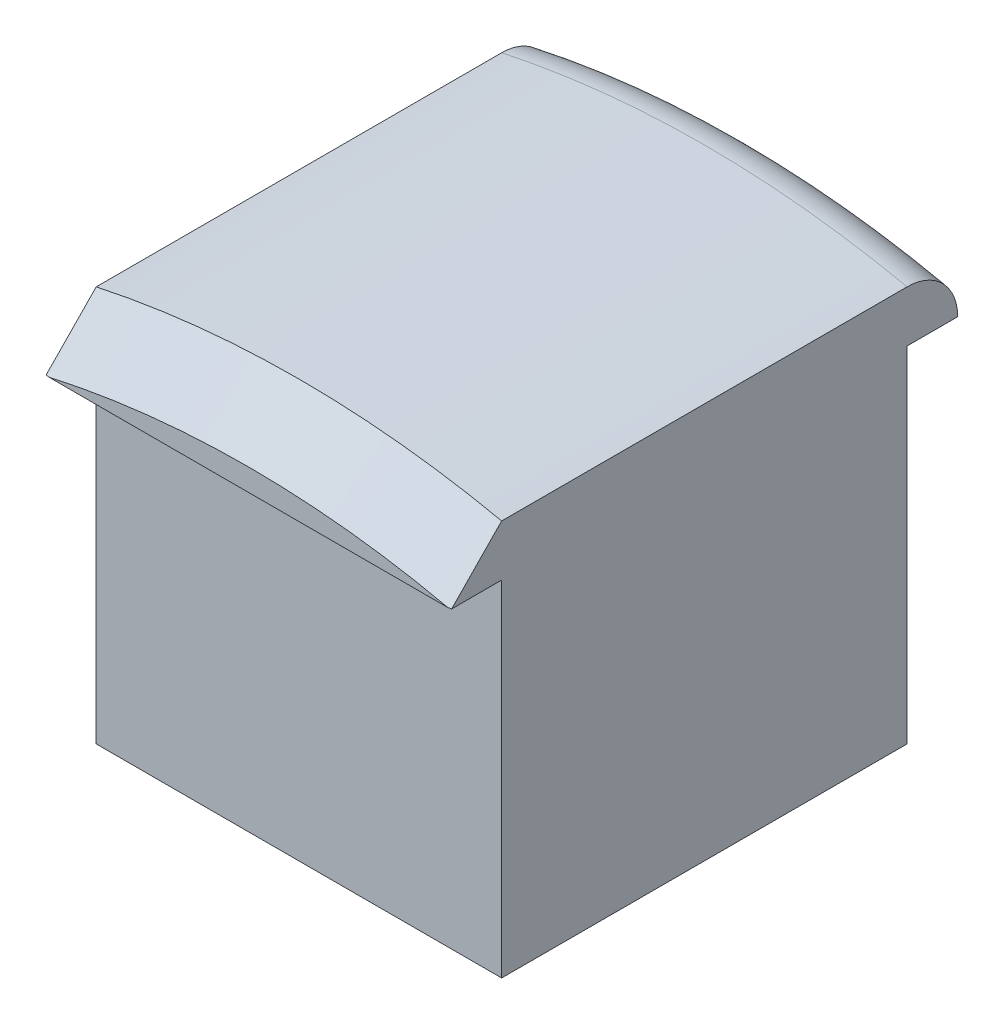
ISO-10303-21;
HEADER;
FILE_DESCRIPTION(('STEP AP214'),'2;1');
FILE_NAME('part.step','',(''),(''),'','','');
FILE_SCHEMA(('AUTOMOTIVE_DESIGN { 1 0 10303 214 1 1 1 1 }'));
ENDSEC;
DATA;
#1=APPLICATION_CONTEXT('core data for automotive mechanical design processes');
#2=APPLICATION_PROTOCOL_DEFINITION('international standard','automotive_design',2000,#1);
#3=PRODUCT_CONTEXT('',#1,'mechanical');
#4=PRODUCT('Part','Part','',(#3));
#5=PRODUCT_RELATED_PRODUCT_CATEGORY('part','',(#4));
#6=PRODUCT_DEFINITION_FORMATION('','',#4);
#7=PRODUCT_DEFINITION_CONTEXT('part definition',#1,'design');
#8=PRODUCT_DEFINITION('design','',#6,#7);
#9=PRODUCT_DEFINITION_SHAPE('','',#8);
#10=(LENGTH_UNIT() NAMED_UNIT(*) SI_UNIT(.MILLI.,.METRE.));
#11=(NAMED_UNIT(*) PLANE_ANGLE_UNIT() SI_UNIT($,.RADIAN.));
#12=(NAMED_UNIT(*) SI_UNIT($,.STERADIAN.) SOLID_ANGLE_UNIT());
#13=UNCERTAINTY_MEASURE_WITH_UNIT(LENGTH_MEASURE(1.E-05),#10,'distance_accuracy_value','');
#14=(GEOMETRIC_REPRESENTATION_CONTEXT(3) GLOBAL_UNCERTAINTY_ASSIGNED_CONTEXT((#13)) GLOBAL_UNIT_ASSIGNED_CONTEXT((#10,
#11,#12)) REPRESENTATION_CONTEXT('',''));
#15=CARTESIAN_POINT('',(0.,0.,0.));
#16=DIRECTION('',(0.,0.,1.));
#17=DIRECTION('',(1.,0.,0.));
#18=AXIS2_PLACEMENT_3D('',#15,#16,#17);
#19=CARTESIAN_POINT('',(-10.7945891997526,0.,50.));
#20=DIRECTION('',(-1.,0.,0.));
#21=DIRECTION('',(0.,-1.,0.));
#22=AXIS2_PLACEMENT_3D('',#19,#20,#21);
#23=PLANE('',#22);
#24=DIRECTION('',(0.,0.,-1.));
#25=VECTOR('',#24,1.);
#26=CARTESIAN_POINT('',(-10.7945891997528,115.897083669474,50.));
#27=LINE('',#26,#25);
#28=CARTESIAN_POINT('',(-10.7945891997528,115.897083669474,45.));
#29=VERTEX_POINT('',#28);
#30=CARTESIAN_POINT('',(-10.7945891997528,115.897083669474,5.));
#31=VERTEX_POINT('',#30);
#32=EDGE_CURVE('E262',#29,#31,#27,.T.);
#33=ORIENTED_EDGE('',*,*,#32,.F.);
#34=CARTESIAN_POINT('',(-10.7945891997528,115.897083669474,45.));
#35=CARTESIAN_POINT('',(-10.7945891997528,115.055807529842,45.8224501634708));
#36=CARTESIAN_POINT('',(-10.7945891997528,114.214262952471,46.6446253855792));
#37=CARTESIAN_POINT('',(-10.7945891997528,112.530636917463,48.2884259517434));
#38=CARTESIAN_POINT('',(-10.7945891997528,111.688555459823,49.1100512957961));
#39=CARTESIAN_POINT('',(-10.7945891997528,110.846205564441,49.9314016984831));
#40=B_SPLINE_CURVE_WITH_KNOTS('',3,(#34,#35,#36,#37,#38,#39),.UNSPECIFIED.,.F.,.F.,(4,2,4),(0.,
3.52952182936607,7.05904367879718),.UNSPECIFIED.);
#41=CARTESIAN_POINT('',(-10.7945891997528,110.846205564441,49.9314016984831));
#42=VERTEX_POINT('',#41);
#43=EDGE_CURVE('E11',#29,#42,#40,.T.);
#44=ORIENTED_EDGE('',*,*,#43,.T.);
#45=DIRECTION('',(0.,0.,-1.));
#46=VECTOR('',#45,1.);
#47=CARTESIAN_POINT('',(-10.7945891997528,110.846205564441,50.));
#48=LINE('',#47,#46);
#49=CARTESIAN_POINT('',(-10.7945891997528,110.846205564441,45.));
#50=VERTEX_POINT('',#49);
#51=EDGE_CURVE('E240',#42,#50,#48,.T.);
#52=ORIENTED_EDGE('',*,*,#51,.T.);
#53=DIRECTION('',(0.,-1.,0.));
#54=VECTOR('',#53,1.);
#55=CARTESIAN_POINT('',(-10.7945891997526,0.,45.));
#56=LINE('',#55,#54);
#57=CARTESIAN_POINT('',(-10.7945891997528,76.8462055644408,45.));
#58=VERTEX_POINT('',#57);
#59=EDGE_CURVE('E243',#50,#58,#56,.T.);
#60=ORIENTED_EDGE('',*,*,#59,.T.);
#61=DIRECTION('',(0.,0.,-1.));
#62=VECTOR('',#61,1.);
#63=CARTESIAN_POINT('',(-10.7945891997528,76.8462055644408,50.));
#64=LINE('',#63,#62);
#65=CARTESIAN_POINT('',(-10.7945891997528,76.8462055644408,5.));
#66=VERTEX_POINT('',#65);
#67=EDGE_CURVE('E251',#58,#66,#64,.T.);
#68=ORIENTED_EDGE('',*,*,#67,.T.);
#69=DIRECTION('',(0.,1.,0.));
#70=VECTOR('',#69,1.);
#71=CARTESIAN_POINT('',(-10.7945891997526,0.,4.99999999999999));
#72=LINE('',#71,#70);
#73=CARTESIAN_POINT('',(-10.7945891997528,110.846205564441,5.));
#74=VERTEX_POINT('',#73);
#75=EDGE_CURVE('E247',#66,#74,#72,.T.);
#76=ORIENTED_EDGE('',*,*,#75,.T.);
#77=DIRECTION('',(0.,0.,-1.));
#78=VECTOR('',#77,1.);
#79=CARTESIAN_POINT('',(-10.7945891997528,110.846205564441,50.));
#80=LINE('',#79,#78);
#81=CARTESIAN_POINT('',(-10.7945891997528,110.846205564441,0.000470594843045291));
#82=VERTEX_POINT('',#81);
#83=EDGE_CURVE('E221',#74,#82,#80,.T.);
#84=ORIENTED_EDGE('',*,*,#83,.T.);
#85=CARTESIAN_POINT('',(-10.7945891997528,110.846205564441,0.000470594843047893));
#86=CARTESIAN_POINT('',(-10.7945891997528,110.992824735912,0.00241884125250696));
#87=CARTESIAN_POINT('',(-10.7945891997528,111.139361629295,0.0105251535922472));
#88=CARTESIAN_POINT('',(-10.7945891997528,111.43124765879,0.0389568587041299));
#89=CARTESIAN_POINT('',(-10.7945891997528,111.576596774703,0.0592824588376026));
#90=CARTESIAN_POINT('',(-10.7945891997528,111.865085477981,0.112056800033257));
#91=CARTESIAN_POINT('',(-10.7945891997528,112.008224965854,0.144506085334537));
#92=CARTESIAN_POINT('',(-10.7945891997528,112.291263078148,0.221333749418454));
#93=CARTESIAN_POINT('',(-10.7945891997528,112.431161787298,0.265711815944276));
#94=CARTESIAN_POINT('',(-10.7945891997528,112.706799437564,0.366164479831274));
#95=CARTESIAN_POINT('',(-10.7945891997528,112.842535627021,0.422246630902114));
#96=CARTESIAN_POINT('',(-10.7945891997528,113.108802769342,0.545765306722478));
#97=CARTESIAN_POINT('',(-10.7945891997528,113.239331778248,0.613206023715194));
#98=CARTESIAN_POINT('',(-10.7945891997528,113.49405290906,0.758941401320211));
#99=CARTESIAN_POINT('',(-10.7945891997528,113.61824978702,0.837227746468482));
#100=CARTESIAN_POINT('',(-10.7945891997528,113.859503331531,1.00420915287417));
#101=CARTESIAN_POINT('',(-10.7945891997528,113.976557555855,1.09290774432923));
#102=CARTESIAN_POINT('',(-10.7945891997528,114.201049862749,1.27884051093465));
#103=CARTESIAN_POINT('',(-10.7945891997528,114.308595572458,1.37594473746499));
#104=CARTESIAN_POINT('',(-10.7945891997528,114.514957399316,1.57902284981378));
#105=CARTESIAN_POINT('',(-10.7945891997528,114.613773727637,1.6849965209517));
#106=CARTESIAN_POINT('',(-10.7945891997528,114.801929149279,1.90512374306444));
#107=CARTESIAN_POINT('',(-10.7945891997528,114.891264406327,2.01928057408188));
#108=CARTESIAN_POINT('',(-10.7945891997528,115.059652213162,2.25487846517248));
#109=CARTESIAN_POINT('',(-10.7945891997528,115.138708717498,2.37631669743847));
#110=CARTESIAN_POINT('',(-10.7945891997528,115.284267472185,2.62282765723561));
#111=CARTESIAN_POINT('',(-10.7945891997528,115.351011842945,2.74775746193799));
#112=CARTESIAN_POINT('',(-10.7945891997528,115.473522828507,3.00282887240683));
#113=CARTESIAN_POINT('',(-10.7945891997528,115.52929385437,3.13296835856587));
#114=CARTESIAN_POINT('',(-10.7945891997528,115.629401213092,3.39747973294122));
#115=CARTESIAN_POINT('',(-10.7945891997528,115.673744865963,3.531848849571));
#116=CARTESIAN_POINT('',(-10.7945891997528,115.75066560474,3.80386316949725));
#117=CARTESIAN_POINT('',(-10.7945891997528,115.783246607586,3.941507265927));
#118=CARTESIAN_POINT('',(-10.7945891997528,115.838826536844,4.23187345591465));
#119=CARTESIAN_POINT('',(-10.7945891997528,115.860668975691,4.38481825071767));
#120=CARTESIAN_POINT('',(-10.7945891997528,115.889799903708,4.69184409044814));
#121=CARTESIAN_POINT('',(-10.7945891997528,115.897111198458,4.84592297338458));
#122=CARTESIAN_POINT('',(-10.7945891997528,115.897083669474,5.));
#123=B_SPLINE_CURVE_WITH_KNOTS('',3,(#85,#86,#87,#88,#89,#90,#91,#92,#93,#94,#95,#96,#97,#98,
#99,#100,#101,#102,#103,#104,#105,#106,#107,#108,#109,#110,#111,#112,#113,#114,#115,#116,#117,
#118,#119,#120,#121,#122),.UNSPECIFIED.,.F.,.F.,(4,2,2,2,2,2,2,2,2,2,2,2,2,2,2,2,2,2,4),(0.,
0.439768076604842,0.8795436162852,1.31933890011123,1.75912267264367,2.19919116026993,
2.63942242665716,3.07931801181938,3.51936317354784,3.95352604575093,4.38767841229298,
4.82200578311586,5.25616555743005,5.6805725578725,6.10480860522797,6.52877222114458,
6.95259452745411,7.41538592575938,7.87745043104914),.UNSPECIFIED.);
#124=EDGE_CURVE('E360',#82,#31,#123,.T.);
#125=ORIENTED_EDGE('',*,*,#124,.T.);
#126=EDGE_LOOP('',(#33,#44,#52,#60,#68,#76,#84,#125));
#127=FACE_BOUND('',#126,.T.);
#128=ADVANCED_FACE('F48',(#127),#23,.F.);
#129=CARTESIAN_POINT('',(-30.7945891997528,23.0262055644407,50.));
#130=DIRECTION('',(0.,0.,-1.));
#131=DIRECTION('',(-1.,0.,0.));
#132=AXIS2_PLACEMENT_3D('',#129,#130,#131);
#133=CYLINDRICAL_SURFACE('',#132,95.);
#134=DIRECTION('',(0.,0.,-1.));
#135=VECTOR('',#134,1.);
#136=CARTESIAN_POINT('',(-50.7945891997528,115.897083669474,50.));
#137=LINE('',#136,#135);
#138=CARTESIAN_POINT('',(-50.7945891997528,115.897083669474,45.));
#139=VERTEX_POINT('',#138);
#140=CARTESIAN_POINT('',(-50.7945891997528,115.897083669474,5.));
#141=VERTEX_POINT('',#140);
#142=EDGE_CURVE('E259',#139,#141,#137,.T.);
#143=ORIENTED_EDGE('',*,*,#142,.F.);
#144=CARTESIAN_POINT('',(-30.7945891997528,23.0262055644407,45.));
#145=DIRECTION('',(0.,0.,1.));
#146=DIRECTION('',(1.,0.,0.));
#147=AXIS2_PLACEMENT_3D('',#144,#145,#146);
#148=CIRCLE('',#147,95.);
#149=EDGE_CURVE('E64',#139,#29,#148,.F.);
#150=ORIENTED_EDGE('',*,*,#149,.T.);
#151=ORIENTED_EDGE('',*,*,#32,.T.);
#152=CARTESIAN_POINT('',(-30.7945891997528,23.0262055644407,5.));
#153=DIRECTION('',(0.,0.,1.));
#154=DIRECTION('',(1.,0.,0.));
#155=AXIS2_PLACEMENT_3D('',#152,#153,#154);
#156=CIRCLE('',#155,95.);
#157=EDGE_CURVE('E273',#31,#141,#156,.T.);
#158=ORIENTED_EDGE('',*,*,#157,.T.);
#159=EDGE_LOOP('',(#143,#150,#151,#158));
#160=FACE_BOUND('',#159,.T.);
#161=ADVANCED_FACE('F377',(#160),#133,.T.);
#162=CARTESIAN_POINT('',(-50.7945891997528,0.,50.));
#163=DIRECTION('',(-1.,0.,0.));
#164=DIRECTION('',(0.,0.,1.));
#165=AXIS2_PLACEMENT_3D('',#162,#163,#164);
#166=PLANE('',#165);
#167=DIRECTION('',(0.,0.,-1.));
#168=VECTOR('',#167,1.);
#169=CARTESIAN_POINT('',(-50.7945891997528,110.846205564441,50.));
#170=LINE('',#169,#168);
#171=CARTESIAN_POINT('',(-50.7945891997528,110.846205564441,49.9314016984831));
#172=VERTEX_POINT('',#171);
#173=CARTESIAN_POINT('',(-50.7945891997528,110.846205564441,45.));
#174=VERTEX_POINT('',#173);
#175=EDGE_CURVE('E212',#172,#174,#170,.T.);
#176=ORIENTED_EDGE('',*,*,#175,.F.);
#177=CARTESIAN_POINT('',(-50.7945891997528,110.846205564441,49.9314016984831));
#178=CARTESIAN_POINT('',(-50.7945891997528,111.688555459823,49.1100512957961));
#179=CARTESIAN_POINT('',(-50.7945891997528,112.530636917463,48.2884259517434));
#180=CARTESIAN_POINT('',(-50.7945891997528,114.214262952471,46.6446253855792));
#181=CARTESIAN_POINT('',(-50.7945891997528,115.055807529842,45.8224501634708));
#182=CARTESIAN_POINT('',(-50.7945891997528,115.897083669474,45.));
#183=B_SPLINE_CURVE_WITH_KNOTS('',3,(#177,#178,#179,#180,#181,#182),.UNSPECIFIED.,.F.,.F.,(4,2,
4),(0.,3.5295218494311,7.05904367879717),.UNSPECIFIED.);
#184=EDGE_CURVE('E78',#172,#139,#183,.T.);
#185=ORIENTED_EDGE('',*,*,#184,.T.);
#186=ORIENTED_EDGE('',*,*,#142,.T.);
#187=CARTESIAN_POINT('',(-50.7945891997528,115.897083669474,5.));
#188=CARTESIAN_POINT('',(-50.7945891997528,115.897100640286,4.86169175819975));
#189=CARTESIAN_POINT('',(-50.7945891997528,115.891214086124,4.72338678120523));
#190=CARTESIAN_POINT('',(-50.7945891997528,115.867757157794,4.44778331834072));
#191=CARTESIAN_POINT('',(-50.7945891997528,115.850187844222,4.3104847422503));
#192=CARTESIAN_POINT('',(-50.7945891997528,115.803520177982,4.03805300206223));
#193=CARTESIAN_POINT('',(-50.7945891997528,115.77443745641,3.90291715947973));
#194=CARTESIAN_POINT('',(-50.7945891997528,115.704981088395,3.63558051347533));
#195=CARTESIAN_POINT('',(-50.7945891997528,115.664607487894,3.50337969811361));
#196=CARTESIAN_POINT('',(-50.7945891997528,115.572884793542,3.24283155121543));
#197=CARTESIAN_POINT('',(-50.7945891997528,115.521534843344,3.11448452123324));
#198=CARTESIAN_POINT('',(-50.7945891997528,115.408243617904,2.86249773611401));
#199=CARTESIAN_POINT('',(-50.7945891997528,115.346298438276,2.73885973688377));
#200=CARTESIAN_POINT('',(-50.7945891997528,115.212335945025,2.49723280267466));
#201=CARTESIAN_POINT('',(-50.7945891997528,115.140322669197,2.37924162838372));
#202=CARTESIAN_POINT('',(-50.7945891997528,114.986724657745,2.14960166702444));
#203=CARTESIAN_POINT('',(-50.7945891997528,114.905136366505,2.03795525902999));
#204=CARTESIAN_POINT('',(-50.7945891997528,114.732243345511,1.82080851950503));
#205=CARTESIAN_POINT('',(-50.7945891997528,114.640857710596,1.71537261116618));
#206=CARTESIAN_POINT('',(-50.7945891997528,114.449630730645,1.51239934321918));
#207=CARTESIAN_POINT('',(-50.7945891997528,114.349786272147,1.41486491799916));
#208=CARTESIAN_POINT('',(-50.7945891997528,114.142414895506,1.2283699085397));
#209=CARTESIAN_POINT('',(-50.7945891997528,114.0348890485,1.13940813293038));
#210=CARTESIAN_POINT('',(-50.7945891997528,113.812873014538,0.970563030582925));
#211=CARTESIAN_POINT('',(-50.7945891997528,113.69838032228,0.890682999649061));
#212=CARTESIAN_POINT('',(-50.7945891997528,113.460780745968,0.738931222829886));
#213=CARTESIAN_POINT('',(-50.7945891997528,113.337542951837,0.667264388396756));
#214=CARTESIAN_POINT('',(-50.7945891997528,113.085510341675,0.534347879199488));
#215=CARTESIAN_POINT('',(-50.7945891997528,112.956713212413,0.473102594243634));
#216=CARTESIAN_POINT('',(-50.7945891997528,112.694590584561,0.361464075216653));
#217=CARTESIAN_POINT('',(-50.7945891997528,112.561268005211,0.31106399364203));
#218=CARTESIAN_POINT('',(-50.7945891997528,112.290942011185,0.221353411181061));
#219=CARTESIAN_POINT('',(-50.7945891997528,112.153937995853,0.182044732128938));
#220=CARTESIAN_POINT('',(-50.7945891997528,111.824099773053,0.101852815239192));
#221=CARTESIAN_POINT('',(-50.7945891997528,111.629973610421,0.0661292009447279));
#222=CARTESIAN_POINT('',(-50.7945891997528,111.336964646439,0.0291006465087537));
#223=CARTESIAN_POINT('',(-50.7945891997528,111.239048242079,0.0195180297900822));
#224=CARTESIAN_POINT('',(-50.7945891997528,111.042843829177,0.00586197013069639));
#225=CARTESIAN_POINT('',(-50.7945891997528,110.944555867102,0.00178785975575689));
#226=CARTESIAN_POINT('',(-50.7945891997528,110.846205564441,0.000470594843047458));
#227=B_SPLINE_CURVE_WITH_KNOTS('',3,(#187,#188,#189,#190,#191,#192,#193,#194,#195,#196,#197,
#198,#199,#200,#201,#202,#203,#204,#205,#206,#207,#208,#209,#210,#211,#212,#213,#214,#215,#216,
#217,#218,#219,#220,#221,#222,#223,#224,#225,#226),.UNSPECIFIED.,.F.,.F.,(4,2,2,2,2,2,2,2,2,2,2,
2,2,2,2,2,2,2,2,4),(0.,0.414794702128333,0.829551753021808,1.24374763243906,1.65794182657772,
2.07216834691746,2.48654784162196,2.90076162421433,3.31512971191674,3.73323042184623,
4.15148569752227,4.56968276277667,4.98803111235585,5.41522033116821,5.84258904933379,
6.26968713618032,6.69685533585059,7.28757698418091,7.58260043714232,7.87758814059408),.UNSPECIFIED.);
#228=CARTESIAN_POINT('',(-50.7945891997528,110.846205564441,0.000470594843047893));
#229=VERTEX_POINT('',#228);
#230=EDGE_CURVE('E277',#141,#229,#227,.T.);
#231=ORIENTED_EDGE('',*,*,#230,.T.);
#232=DIRECTION('',(0.,0.,-1.));
#233=VECTOR('',#232,1.);
#234=CARTESIAN_POINT('',(-50.7945891997528,110.846205564441,0.));
#235=LINE('',#234,#233);
#236=CARTESIAN_POINT('',(-50.7945891997528,110.846205564441,5.));
#237=VERTEX_POINT('',#236);
#238=EDGE_CURVE('E211',#237,#229,#235,.T.);
#239=ORIENTED_EDGE('',*,*,#238,.F.);
#240=DIRECTION('',(0.,1.,0.));
#241=VECTOR('',#240,1.);
#242=CARTESIAN_POINT('',(-50.7945891997528,110.846205564441,5.));
#243=LINE('',#242,#241);
#244=CARTESIAN_POINT('',(-50.7945891997528,76.8462055644408,5.));
#245=VERTEX_POINT('',#244);
#246=EDGE_CURVE('E207',#245,#237,#243,.T.);
#247=ORIENTED_EDGE('',*,*,#246,.F.);
#248=DIRECTION('',(0.,0.,-1.));
#249=VECTOR('',#248,1.);
#250=CARTESIAN_POINT('',(-50.7945891997528,76.8462055644408,50.));
#251=LINE('',#250,#249);
#252=CARTESIAN_POINT('',(-50.7945891997528,76.8462055644408,45.));
#253=VERTEX_POINT('',#252);
#254=EDGE_CURVE('E255',#253,#245,#251,.T.);
#255=ORIENTED_EDGE('',*,*,#254,.F.);
#256=DIRECTION('',(0.,-1.,0.));
#257=VECTOR('',#256,1.);
#258=CARTESIAN_POINT('',(-50.7945891997528,110.846205564441,45.));
#259=LINE('',#258,#257);
#260=EDGE_CURVE('E229',#174,#253,#259,.T.);
#261=ORIENTED_EDGE('',*,*,#260,.F.);
#262=EDGE_LOOP('',(#176,#185,#186,#231,#239,#247,#255,#261));
#263=FACE_BOUND('',#262,.T.);
#264=ADVANCED_FACE('F292',(#263),#166,.T.);
#265=CARTESIAN_POINT('',(0.,76.8462055644408,50.));
#266=DIRECTION('',(0.,1.,0.));
#267=DIRECTION('',(0.,0.,1.));
#268=AXIS2_PLACEMENT_3D('',#265,#266,#267);
#269=PLANE('',#268);
#270=ORIENTED_EDGE('',*,*,#254,.T.);
#271=DIRECTION('',(-1.,0.,0.));
#272=VECTOR('',#271,1.);
#273=CARTESIAN_POINT('',(-0.794589199752775,76.8462055644408,5.));
#274=LINE('',#273,#272);
#275=EDGE_CURVE('E216',#66,#245,#274,.T.);
#276=ORIENTED_EDGE('',*,*,#275,.F.);
#277=ORIENTED_EDGE('',*,*,#67,.F.);
#278=DIRECTION('',(-1.,0.,0.));
#279=VECTOR('',#278,1.);
#280=CARTESIAN_POINT('',(-0.794589199752775,76.8462055644408,45.));
#281=LINE('',#280,#279);
#282=EDGE_CURVE('E200',#58,#253,#281,.T.);
#283=ORIENTED_EDGE('',*,*,#282,.T.);
#284=EDGE_LOOP('',(#270,#276,#277,#283));
#285=FACE_BOUND('',#284,.T.);
#286=ADVANCED_FACE('F390',(#285),#269,.F.);
#287=CARTESIAN_POINT('',(0.,0.,50.));
#288=DIRECTION('',(0.,0.,1.));
#289=DIRECTION('',(1.,0.,0.));
#290=AXIS2_PLACEMENT_3D('',#287,#288,#289);
#291=PLANE('',#290);
#292=DIRECTION('',(-1.,0.,0.));
#293=VECTOR('',#292,1.);
#294=CARTESIAN_POINT('',(0.,110.846205564441,50.));
#295=LINE('',#294,#293);
#296=CARTESIAN_POINT('',(-11.1058208279121,110.846205564441,50.));
#297=VERTEX_POINT('',#296);
#298=CARTESIAN_POINT('',(-50.4833575715935,110.846205564441,50.));
#299=VERTEX_POINT('',#298);
#300=EDGE_CURVE('E269',#297,#299,#295,.T.);
#301=ORIENTED_EDGE('',*,*,#300,.F.);
#302=CARTESIAN_POINT('',(-30.7945891997528,23.0262055644407,50.));
#303=DIRECTION('',(0.,0.,1.));
#304=DIRECTION('',(1.,0.,0.));
#305=AXIS2_PLACEMENT_3D('',#302,#303,#304);
#306=CIRCLE('',#305,90.);
#307=EDGE_CURVE('E357',#297,#299,#306,.T.);
#308=ORIENTED_EDGE('',*,*,#307,.T.);
#309=EDGE_LOOP('',(#301,#308));
#310=FACE_BOUND('',#309,.T.);
#311=ADVANCED_FACE('F384',(#310),#291,.T.);
#312=CARTESIAN_POINT('',(0.,0.,0.));
#313=DIRECTION('',(0.,0.,1.));
#314=DIRECTION('',(1.,0.,0.));
#315=AXIS2_PLACEMENT_3D('',#312,#313,#314);
#316=PLANE('',#315);
#317=DIRECTION('',(-1.,0.,0.));
#318=VECTOR('',#317,1.);
#319=CARTESIAN_POINT('',(0.,110.846205564441,0.));
#320=LINE('',#319,#318);
#321=CARTESIAN_POINT('',(-11.105820827912,110.846205564441,0.));
#322=VERTEX_POINT('',#321);
#323=CARTESIAN_POINT('',(-50.4833575715936,110.846205564441,0.));
#324=VERTEX_POINT('',#323);
#325=EDGE_CURVE('E265',#322,#324,#320,.T.);
#326=ORIENTED_EDGE('',*,*,#325,.T.);
#327=CARTESIAN_POINT('',(-30.7945891997528,23.0262055644407,0.));
#328=DIRECTION('',(0.,0.,1.));
#329=DIRECTION('',(1.,0.,0.));
#330=AXIS2_PLACEMENT_3D('',#327,#328,#329);
#331=CIRCLE('',#330,90.);
#332=EDGE_CURVE('E312',#324,#322,#331,.F.);
#333=ORIENTED_EDGE('',*,*,#332,.T.);
#334=EDGE_LOOP('',(#326,#333));
#335=FACE_BOUND('',#334,.T.);
#336=ADVANCED_FACE('F325',(#335),#316,.F.);
#337=CARTESIAN_POINT('',(-0.794589199752775,110.846205564441,5.));
#338=DIRECTION('',(0.,0.,1.));
#339=DIRECTION('',(0.,-1.,0.));
#340=AXIS2_PLACEMENT_3D('',#337,#338,#339);
#341=PLANE('',#340);
#342=DIRECTION('',(-1.,0.,0.));
#343=VECTOR('',#342,1.);
#344=CARTESIAN_POINT('',(-12.7945891997528,78.8462055644408,5.));
#345=LINE('',#344,#343);
#346=CARTESIAN_POINT('',(-12.7945891997528,78.8462055644408,5.));
#347=VERTEX_POINT('',#346);
#348=CARTESIAN_POINT('',(-48.7945891997528,78.8462055644408,5.));
#349=VERTEX_POINT('',#348);
#350=EDGE_CURVE('E186',#347,#349,#345,.T.);
#351=ORIENTED_EDGE('',*,*,#350,.F.);
#352=DIRECTION('',(0.,-1.,0.));
#353=VECTOR('',#352,1.);
#354=CARTESIAN_POINT('',(-12.7945891997528,110.846205564441,5.));
#355=LINE('',#354,#353);
#356=CARTESIAN_POINT('',(-12.7945891997528,110.846205564441,5.));
#357=VERTEX_POINT('',#356);
#358=EDGE_CURVE('E163',#357,#347,#355,.T.);
#359=ORIENTED_EDGE('',*,*,#358,.F.);
#360=DIRECTION('',(-1.,0.,0.));
#361=VECTOR('',#360,1.);
#362=CARTESIAN_POINT('',(-0.794589199752775,110.846205564441,5.));
#363=LINE('',#362,#361);
#364=EDGE_CURVE('E217',#74,#357,#363,.T.);
#365=ORIENTED_EDGE('',*,*,#364,.F.);
#366=ORIENTED_EDGE('',*,*,#75,.F.);
#367=ORIENTED_EDGE('',*,*,#275,.T.);
#368=ORIENTED_EDGE('',*,*,#246,.T.);
#369=CARTESIAN_POINT('',(-48.7945891997528,110.846205564441,5.));
#370=VERTEX_POINT('',#369);
#371=EDGE_CURVE('E222',#370,#237,#363,.T.);
#372=ORIENTED_EDGE('',*,*,#371,.F.);
#373=DIRECTION('',(0.,1.,0.));
#374=VECTOR('',#373,1.);
#375=CARTESIAN_POINT('',(-48.7945891997528,110.846205564441,5.));
#376=LINE('',#375,#374);
#377=EDGE_CURVE('E183',#349,#370,#376,.T.);
#378=ORIENTED_EDGE('',*,*,#377,.F.);
#379=EDGE_LOOP('',(#351,#359,#365,#366,#367,#368,#372,#378));
#380=FACE_BOUND('',#379,.T.);
#381=ADVANCED_FACE('F319',(#380),#341,.F.);
#382=CARTESIAN_POINT('',(-0.794589199752775,110.846205564441,0.));
#383=DIRECTION('',(0.,1.,0.));
#384=DIRECTION('',(0.,0.,1.));
#385=AXIS2_PLACEMENT_3D('',#382,#383,#384);
#386=PLANE('',#385);
#387=ORIENTED_EDGE('',*,*,#238,.T.);
#388=CARTESIAN_POINT('',(-50.7945891997528,110.846205564441,0.000470594843047893));
#389=CARTESIAN_POINT('',(-50.7427173809836,110.846205564441,0.000313143238279812));
#390=CARTESIAN_POINT('',(-50.6908455024744,110.846205564441,0.000195201198976157));
#391=CARTESIAN_POINT('',(-50.5871016264213,110.846205564441,3.83362519713775E-05));
#392=CARTESIAN_POINT('',(-50.5352296288775,110.846205564441,-5.86656408465413E-07));
#393=CARTESIAN_POINT('',(-50.4833575715936,110.846205564441,0.));
#394=B_SPLINE_CURVE_WITH_KNOTS('',3,(#388,#389,#390,#391,#392,#393),.UNSPECIFIED.,.F.,.F.,(4,2,
4),(0.,0.155616037777672,0.311232074218711),.UNSPECIFIED.);
#395=EDGE_CURVE('E305',#229,#324,#394,.T.);
#396=ORIENTED_EDGE('',*,*,#395,.T.);
#397=ORIENTED_EDGE('',*,*,#325,.F.);
#398=CARTESIAN_POINT('',(-11.105820827912,110.846205564441,0.));
#399=CARTESIAN_POINT('',(-11.0539487706281,110.846205564441,-5.8665640689847E-07));
#400=CARTESIAN_POINT('',(-11.0020767730843,110.846205564441,3.83362519722024E-05));
#401=CARTESIAN_POINT('',(-10.8983328970312,110.846205564441,0.000195201198976079));
#402=CARTESIAN_POINT('',(-10.846461018522,110.846205564441,0.000313143238279571));
#403=CARTESIAN_POINT('',(-10.7945891997528,110.846205564441,0.000470594843047777));
#404=B_SPLINE_CURVE_WITH_KNOTS('',3,(#398,#399,#400,#401,#402,#403),.UNSPECIFIED.,.F.,.F.,(4,2,
4),(0.,0.155616036441034,0.311232074218693),.UNSPECIFIED.);
#405=EDGE_CURVE('E285',#322,#82,#404,.T.);
#406=ORIENTED_EDGE('',*,*,#405,.T.);
#407=ORIENTED_EDGE('',*,*,#83,.F.);
#408=ORIENTED_EDGE('',*,*,#364,.T.);
#409=DIRECTION('',(0.,0.,-1.));
#410=VECTOR('',#409,1.);
#411=CARTESIAN_POINT('',(-12.7945891997528,110.846205564441,43.));
#412=LINE('',#411,#410);
#413=CARTESIAN_POINT('',(-12.7945891997528,110.846205564441,43.));
#414=VERTEX_POINT('',#413);
#415=EDGE_CURVE('E197',#414,#357,#412,.T.);
#416=ORIENTED_EDGE('',*,*,#415,.F.);
#417=DIRECTION('',(1.,0.,0.));
#418=VECTOR('',#417,1.);
#419=CARTESIAN_POINT('',(-12.7945891997528,110.846205564441,43.));
#420=LINE('',#419,#418);
#421=CARTESIAN_POINT('',(-48.7945891997528,110.846205564441,43.));
#422=VERTEX_POINT('',#421);
#423=EDGE_CURVE('E169',#422,#414,#420,.T.);
#424=ORIENTED_EDGE('',*,*,#423,.F.);
#425=DIRECTION('',(0.,0.,-1.));
#426=VECTOR('',#425,1.);
#427=CARTESIAN_POINT('',(-48.7945891997528,110.846205564441,43.));
#428=LINE('',#427,#426);
#429=EDGE_CURVE('E201',#422,#370,#428,.T.);
#430=ORIENTED_EDGE('',*,*,#429,.T.);
#431=ORIENTED_EDGE('',*,*,#371,.T.);
#432=EDGE_LOOP('',(#387,#396,#397,#406,#407,#408,#416,#424,#430,#431));
#433=FACE_BOUND('',#432,.T.);
#434=ADVANCED_FACE('F313',(#433),#386,.F.);
#435=CARTESIAN_POINT('',(-0.794589199752775,110.846205564441,45.));
#436=DIRECTION('',(0.,0.,-1.));
#437=DIRECTION('',(0.,1.,0.));
#438=AXIS2_PLACEMENT_3D('',#435,#436,#437);
#439=PLANE('',#438);
#440=DIRECTION('',(-1.,0.,0.));
#441=VECTOR('',#440,1.);
#442=CARTESIAN_POINT('',(-0.794589199752775,110.846205564441,45.));
#443=LINE('',#442,#441);
#444=EDGE_CURVE('E225',#50,#174,#443,.T.);
#445=ORIENTED_EDGE('',*,*,#444,.T.);
#446=ORIENTED_EDGE('',*,*,#260,.T.);
#447=ORIENTED_EDGE('',*,*,#282,.F.);
#448=ORIENTED_EDGE('',*,*,#59,.F.);
#449=EDGE_LOOP('',(#445,#446,#447,#448));
#450=FACE_BOUND('',#449,.T.);
#451=ADVANCED_FACE('F318',(#450),#439,.F.);
#452=CARTESIAN_POINT('',(-0.794589199752775,110.846205564441,50.));
#453=DIRECTION('',(0.,1.,0.));
#454=DIRECTION('',(0.,0.,1.));
#455=AXIS2_PLACEMENT_3D('',#452,#453,#454);
#456=PLANE('',#455);
#457=ORIENTED_EDGE('',*,*,#300,.T.);
#458=CARTESIAN_POINT('',(-50.4833575715935,110.846205564441,50.));
#459=CARTESIAN_POINT('',(-50.5352474395652,110.846205564441,49.9886482981472));
#460=CARTESIAN_POINT('',(-50.5871283425704,110.846205564441,49.9772559220931));
#461=CARTESIAN_POINT('',(-50.6908722186235,110.846205564441,49.9543898215874));
#462=CARTESIAN_POINT('',(-50.7427351916714,110.846205564441,49.9429160971359));
#463=CARTESIAN_POINT('',(-50.7945891997528,110.846205564441,49.9314016984832));
#464=B_SPLINE_CURVE_WITH_KNOTS('',3,(#458,#459,#460,#461,#462,#463),.UNSPECIFIED.,.F.,.F.,(4,2,
4),(0.,0.159350961588468,0.318701923102291),.UNSPECIFIED.);
#465=EDGE_CURVE('E342',#299,#172,#464,.T.);
#466=ORIENTED_EDGE('',*,*,#465,.T.);
#467=ORIENTED_EDGE('',*,*,#175,.T.);
#468=ORIENTED_EDGE('',*,*,#444,.F.);
#469=ORIENTED_EDGE('',*,*,#51,.F.);
#470=CARTESIAN_POINT('',(-10.7945891997528,110.846205564441,49.9314016984831));
#471=CARTESIAN_POINT('',(-10.8464432078341,110.846205564441,49.9429160971359));
#472=CARTESIAN_POINT('',(-10.898306180882,110.846205564441,49.9543898215874));
#473=CARTESIAN_POINT('',(-11.0020500569351,110.846205564441,49.9772559220931));
#474=CARTESIAN_POINT('',(-11.0539309599403,110.846205564441,49.9886482981472));
#475=CARTESIAN_POINT('',(-11.1058208279121,110.846205564441,50.));
#476=B_SPLINE_CURVE_WITH_KNOTS('',3,(#470,#471,#472,#473,#474,#475),.UNSPECIFIED.,.F.,.F.,(4,2,
4),(0.,0.15935096151381,0.31870192310227),.UNSPECIFIED.);
#477=EDGE_CURVE('E335',#42,#297,#476,.T.);
#478=ORIENTED_EDGE('',*,*,#477,.T.);
#479=EDGE_LOOP('',(#457,#466,#467,#468,#469,#478));
#480=FACE_BOUND('',#479,.T.);
#481=ADVANCED_FACE('F327',(#480),#456,.F.);
#482=CARTESIAN_POINT('',(-12.7945891997528,110.846205564441,43.));
#483=DIRECTION('',(1.,0.,0.));
#484=DIRECTION('',(0.,1.,0.));
#485=AXIS2_PLACEMENT_3D('',#482,#483,#484);
#486=PLANE('',#485);
#487=ORIENTED_EDGE('',*,*,#358,.T.);
#488=DIRECTION('',(0.,0.,-1.));
#489=VECTOR('',#488,1.);
#490=CARTESIAN_POINT('',(-12.7945891997528,78.8462055644408,43.));
#491=LINE('',#490,#489);
#492=CARTESIAN_POINT('',(-12.7945891997528,78.8462055644408,43.));
#493=VERTEX_POINT('',#492);
#494=EDGE_CURVE('E156',#493,#347,#491,.T.);
#495=ORIENTED_EDGE('',*,*,#494,.F.);
#496=DIRECTION('',(0.,-1.,0.));
#497=VECTOR('',#496,1.);
#498=CARTESIAN_POINT('',(-12.7945891997528,110.846205564441,43.));
#499=LINE('',#498,#497);
#500=EDGE_CURVE('E160',#414,#493,#499,.T.);
#501=ORIENTED_EDGE('',*,*,#500,.F.);
#502=ORIENTED_EDGE('',*,*,#415,.T.);
#503=EDGE_LOOP('',(#487,#495,#501,#502));
#504=FACE_BOUND('',#503,.T.);
#505=ADVANCED_FACE('F158',(#504),#486,.F.);
#506=CARTESIAN_POINT('',(-48.7945891997528,110.846205564441,43.));
#507=DIRECTION('',(-1.,0.,0.));
#508=DIRECTION('',(0.,-1.,0.));
#509=AXIS2_PLACEMENT_3D('',#506,#507,#508);
#510=PLANE('',#509);
#511=ORIENTED_EDGE('',*,*,#377,.T.);
#512=ORIENTED_EDGE('',*,*,#429,.F.);
#513=DIRECTION('',(0.,1.,0.));
#514=VECTOR('',#513,1.);
#515=CARTESIAN_POINT('',(-48.7945891997528,110.846205564441,43.));
#516=LINE('',#515,#514);
#517=CARTESIAN_POINT('',(-48.7945891997528,78.8462055644408,43.));
#518=VERTEX_POINT('',#517);
#519=EDGE_CURVE('E178',#518,#422,#516,.T.);
#520=ORIENTED_EDGE('',*,*,#519,.F.);
#521=DIRECTION('',(0.,0.,-1.));
#522=VECTOR('',#521,1.);
#523=CARTESIAN_POINT('',(-48.7945891997528,78.8462055644408,43.));
#524=LINE('',#523,#522);
#525=EDGE_CURVE('E168',#518,#349,#524,.T.);
#526=ORIENTED_EDGE('',*,*,#525,.T.);
#527=EDGE_LOOP('',(#511,#512,#520,#526));
#528=FACE_BOUND('',#527,.T.);
#529=ADVANCED_FACE('F417',(#528),#510,.F.);
#530=CARTESIAN_POINT('',(-12.7945891997528,78.8462055644408,43.));
#531=DIRECTION('',(0.,-1.,0.));
#532=DIRECTION('',(0.,0.,-1.));
#533=AXIS2_PLACEMENT_3D('',#530,#531,#532);
#534=PLANE('',#533);
#535=ORIENTED_EDGE('',*,*,#350,.T.);
#536=ORIENTED_EDGE('',*,*,#525,.F.);
#537=DIRECTION('',(-1.,0.,0.));
#538=VECTOR('',#537,1.);
#539=CARTESIAN_POINT('',(-12.7945891997528,78.8462055644408,43.));
#540=LINE('',#539,#538);
#541=EDGE_CURVE('E172',#493,#518,#540,.T.);
#542=ORIENTED_EDGE('',*,*,#541,.F.);
#543=ORIENTED_EDGE('',*,*,#494,.T.);
#544=EDGE_LOOP('',(#535,#536,#542,#543));
#545=FACE_BOUND('',#544,.T.);
#546=ADVANCED_FACE('F173',(#545),#534,.F.);
#547=CARTESIAN_POINT('',(0.,0.,43.));
#548=DIRECTION('',(0.,0.,-1.));
#549=DIRECTION('',(0.,1.,0.));
#550=AXIS2_PLACEMENT_3D('',#547,#548,#549);
#551=PLANE('',#550);
#552=ORIENTED_EDGE('',*,*,#500,.T.);
#553=ORIENTED_EDGE('',*,*,#541,.T.);
#554=ORIENTED_EDGE('',*,*,#519,.T.);
#555=ORIENTED_EDGE('',*,*,#423,.T.);
#556=EDGE_LOOP('',(#552,#553,#554,#555));
#557=FACE_BOUND('',#556,.T.);
#558=ADVANCED_FACE('F180',(#557),#551,.T.);
#559=CARTESIAN_POINT('',(-30.7945891997528,23.0262055644407,5.));
#560=DIRECTION('',(0.,0.,1.));
#561=DIRECTION('',(1.,0.,0.));
#562=AXIS2_PLACEMENT_3D('',#559,#560,#561);
#563=TOROIDAL_SURFACE('',#562,90.,5.);
#564=ORIENTED_EDGE('',*,*,#405,.F.);
#565=ORIENTED_EDGE('',*,*,#332,.F.);
#566=ORIENTED_EDGE('',*,*,#395,.F.);
#567=ORIENTED_EDGE('',*,*,#230,.F.);
#568=ORIENTED_EDGE('',*,*,#157,.F.);
#569=ORIENTED_EDGE('',*,*,#124,.F.);
#570=EDGE_LOOP('',(#564,#565,#566,#567,#568,#569));
#571=FACE_BOUND('',#570,.T.);
#572=ADVANCED_FACE('F296',(#571),#563,.T.);
#573=CARTESIAN_POINT('',(-30.7945891997528,23.0262055644407,50.));
#574=DIRECTION('',(0.,0.,-1.));
#575=DIRECTION('',(-1.,0.,0.));
#576=AXIS2_PLACEMENT_3D('',#573,#574,#575);
#577=CONICAL_SURFACE('',#576,90.,0.785398163397448);
#578=ORIENTED_EDGE('',*,*,#43,.F.);
#579=ORIENTED_EDGE('',*,*,#149,.F.);
#580=ORIENTED_EDGE('',*,*,#184,.F.);
#581=ORIENTED_EDGE('',*,*,#465,.F.);
#582=ORIENTED_EDGE('',*,*,#307,.F.);
#583=ORIENTED_EDGE('',*,*,#477,.F.);
#584=EDGE_LOOP('',(#578,#579,#580,#581,#582,#583));
#585=FACE_BOUND('',#584,.T.);
#586=ADVANCED_FACE('F51',(#585),#577,.T.);
#587=CLOSED_SHELL('',(#128,#161,#264,#286,#311,#336,#381,#434,#451,#481,#505,#529,#546,#558,
#572,#586));
#588=MANIFOLD_SOLID_BREP('B2',#587);
#589=ADVANCED_BREP_SHAPE_REPRESENTATION('',(#18,#588),#14);
#590=SHAPE_DEFINITION_REPRESENTATION(#9,#589);
ENDSEC;
END-ISO-10303-21;
